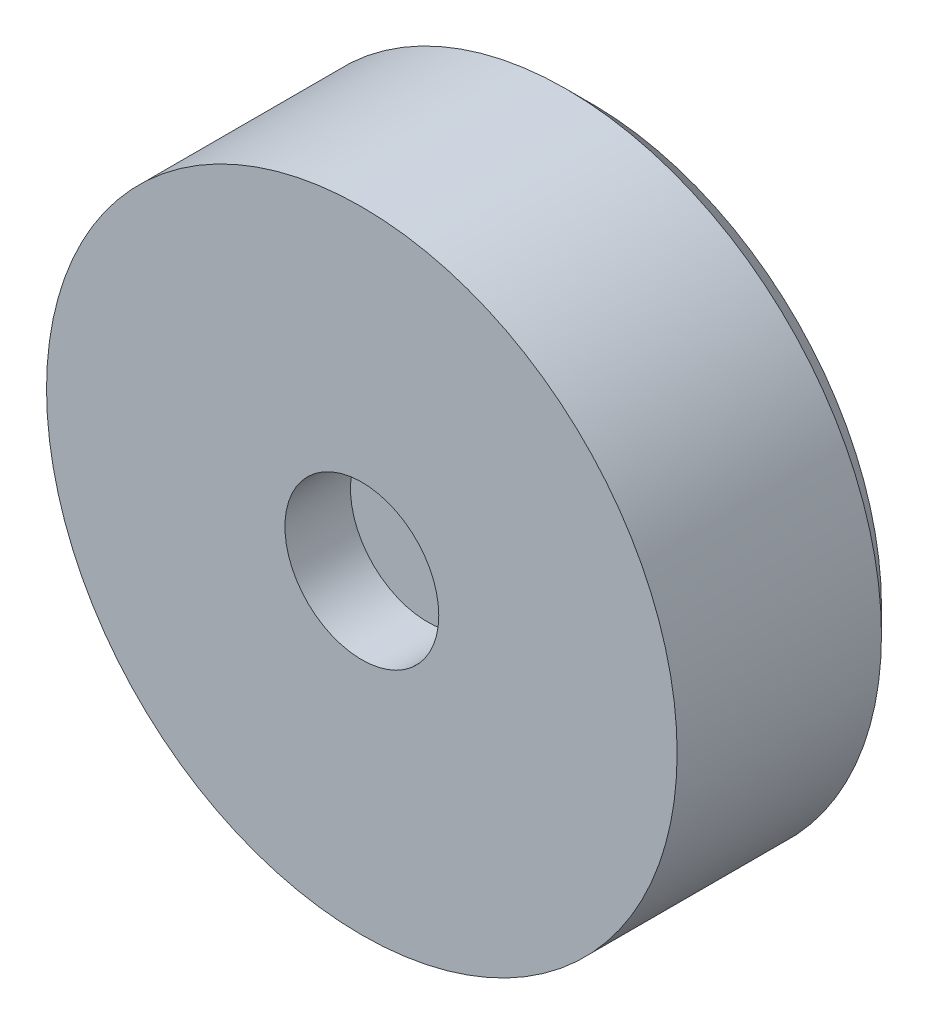
ISO-10303-21;
HEADER;
FILE_DESCRIPTION(('STEP AP214'),'2;1');
FILE_NAME('part.step','',(''),(''),'','','');
FILE_SCHEMA(('AUTOMOTIVE_DESIGN { 1 0 10303 214 1 1 1 1 }'));
ENDSEC;
DATA;
#1=APPLICATION_CONTEXT('core data for automotive mechanical design processes');
#2=APPLICATION_PROTOCOL_DEFINITION('international standard','automotive_design',2000,#1);
#3=PRODUCT_CONTEXT('',#1,'mechanical');
#4=PRODUCT('Part','Part','',(#3));
#5=PRODUCT_RELATED_PRODUCT_CATEGORY('part','',(#4));
#6=PRODUCT_DEFINITION_FORMATION('','',#4);
#7=PRODUCT_DEFINITION_CONTEXT('part definition',#1,'design');
#8=PRODUCT_DEFINITION('design','',#6,#7);
#9=PRODUCT_DEFINITION_SHAPE('','',#8);
#10=(LENGTH_UNIT() NAMED_UNIT(*) SI_UNIT(.MILLI.,.METRE.));
#11=(NAMED_UNIT(*) PLANE_ANGLE_UNIT() SI_UNIT($,.RADIAN.));
#12=(NAMED_UNIT(*) SI_UNIT($,.STERADIAN.) SOLID_ANGLE_UNIT());
#13=UNCERTAINTY_MEASURE_WITH_UNIT(LENGTH_MEASURE(1.E-05),#10,'distance_accuracy_value','');
#14=(GEOMETRIC_REPRESENTATION_CONTEXT(3) GLOBAL_UNCERTAINTY_ASSIGNED_CONTEXT((#13)) GLOBAL_UNIT_ASSIGNED_CONTEXT((#10,
#11,#12)) REPRESENTATION_CONTEXT('',''));
#15=CARTESIAN_POINT('',(0.,0.,0.));
#16=DIRECTION('',(0.,0.,1.));
#17=DIRECTION('',(1.,0.,0.));
#18=AXIS2_PLACEMENT_3D('',#15,#16,#17);
#19=CARTESIAN_POINT('',(0.,0.,0.));
#20=DIRECTION('',(0.,0.,1.));
#21=DIRECTION('',(1.,0.,0.));
#22=AXIS2_PLACEMENT_3D('',#19,#20,#21);
#23=PLANE('',#22);
#24=CARTESIAN_POINT('',(0.,0.,0.));
#25=DIRECTION('',(0.,0.,1.));
#26=DIRECTION('',(1.,0.,0.));
#27=AXIS2_PLACEMENT_3D('',#24,#25,#26);
#28=CIRCLE('',#27,11.5);
#29=CARTESIAN_POINT('',(11.5,0.,0.));
#30=VERTEX_POINT('',#29);
#31=EDGE_CURVE('E41',#30,#30,#28,.F.);
#32=ORIENTED_EDGE('',*,*,#31,.T.);
#33=EDGE_LOOP('',(#32));
#34=FACE_BOUND('',#33,.T.);
#35=DIRECTION('',(0.5,-0.866025403784439,0.));
#36=VECTOR('',#35,1.);
#37=CARTESIAN_POINT('',(-9.8726896031426,0.,0.));
#38=LINE('',#37,#36);
#39=CARTESIAN_POINT('',(-9.8726896031426,0.,0.));
#40=VERTEX_POINT('',#39);
#41=CARTESIAN_POINT('',(-4.9363448015713,-8.55,0.));
#42=VERTEX_POINT('',#41);
#43=EDGE_CURVE('E48',#40,#42,#38,.T.);
#44=ORIENTED_EDGE('',*,*,#43,.T.);
#45=DIRECTION('',(1.,0.,0.));
#46=VECTOR('',#45,1.);
#47=CARTESIAN_POINT('',(-4.9363448015713,-8.55,0.));
#48=LINE('',#47,#46);
#49=CARTESIAN_POINT('',(4.9363448015713,-8.55,0.));
#50=VERTEX_POINT('',#49);
#51=EDGE_CURVE('E107',#42,#50,#48,.T.);
#52=ORIENTED_EDGE('',*,*,#51,.T.);
#53=DIRECTION('',(0.5,0.866025403784439,0.));
#54=VECTOR('',#53,1.);
#55=CARTESIAN_POINT('',(4.9363448015713,-8.55,0.));
#56=LINE('',#55,#54);
#57=CARTESIAN_POINT('',(9.8726896031426,0.,0.));
#58=VERTEX_POINT('',#57);
#59=EDGE_CURVE('E105',#50,#58,#56,.T.);
#60=ORIENTED_EDGE('',*,*,#59,.T.);
#61=DIRECTION('',(-0.5,0.866025403784439,0.));
#62=VECTOR('',#61,1.);
#63=CARTESIAN_POINT('',(9.8726896031426,0.,0.));
#64=LINE('',#63,#62);
#65=CARTESIAN_POINT('',(4.9363448015713,8.55,0.));
#66=VERTEX_POINT('',#65);
#67=EDGE_CURVE('E84',#58,#66,#64,.T.);
#68=ORIENTED_EDGE('',*,*,#67,.T.);
#69=DIRECTION('',(-1.,0.,0.));
#70=VECTOR('',#69,1.);
#71=CARTESIAN_POINT('',(4.9363448015713,8.55,0.));
#72=LINE('',#71,#70);
#73=CARTESIAN_POINT('',(-4.9363448015713,8.55,0.));
#74=VERTEX_POINT('',#73);
#75=EDGE_CURVE('E95',#66,#74,#72,.T.);
#76=ORIENTED_EDGE('',*,*,#75,.T.);
#77=DIRECTION('',(-0.5,-0.866025403784439,0.));
#78=VECTOR('',#77,1.);
#79=CARTESIAN_POINT('',(-4.9363448015713,8.55,0.));
#80=LINE('',#79,#78);
#81=EDGE_CURVE('E101',#74,#40,#80,.T.);
#82=ORIENTED_EDGE('',*,*,#81,.T.);
#83=EDGE_LOOP('',(#44,#52,#60,#68,#76,#82));
#84=FACE_BOUND('',#83,.T.);
#85=ADVANCED_FACE('F33',(#34,#84),#23,.F.);
#86=CARTESIAN_POINT('',(0.,0.,2.5));
#87=DIRECTION('',(0.,0.,-1.));
#88=DIRECTION('',(-1.,0.,0.));
#89=AXIS2_PLACEMENT_3D('',#86,#87,#88);
#90=CYLINDRICAL_SURFACE('',#89,12.5);
#91=CARTESIAN_POINT('',(0.,0.,1.));
#92=DIRECTION('',(0.,0.,1.));
#93=DIRECTION('',(1.,0.,0.));
#94=AXIS2_PLACEMENT_3D('',#91,#92,#93);
#95=CIRCLE('',#94,12.5);
#96=CARTESIAN_POINT('',(12.5,0.,1.));
#97=VERTEX_POINT('',#96);
#98=EDGE_CURVE('E124',#97,#97,#95,.T.);
#99=ORIENTED_EDGE('',*,*,#98,.T.);
#100=EDGE_LOOP('',(#99));
#101=FACE_BOUND('',#100,.T.);
#102=CARTESIAN_POINT('',(0.,0.,9.1));
#103=DIRECTION('',(0.,0.,1.));
#104=DIRECTION('',(1.,0.,0.));
#105=AXIS2_PLACEMENT_3D('',#102,#103,#104);
#106=CIRCLE('',#105,12.5);
#107=CARTESIAN_POINT('',(12.5,0.,9.1));
#108=VERTEX_POINT('',#107);
#109=EDGE_CURVE('E142',#108,#108,#106,.T.);
#110=ORIENTED_EDGE('',*,*,#109,.F.);
#111=EDGE_LOOP('',(#110));
#112=FACE_BOUND('',#111,.T.);
#113=ADVANCED_FACE('F136',(#101,#112),#90,.T.);
#114=CARTESIAN_POINT('',(-9.8726896031426,0.,2.5));
#115=DIRECTION('',(0.866025403784438,0.5,0.));
#116=DIRECTION('',(-0.5,0.866025403784438,0.));
#117=AXIS2_PLACEMENT_3D('',#114,#115,#116);
#118=PLANE('',#117);
#119=ORIENTED_EDGE('',*,*,#43,.F.);
#120=DIRECTION('',(0.,0.,-1.));
#121=VECTOR('',#120,1.);
#122=CARTESIAN_POINT('',(-9.8726896031426,0.,2.5));
#123=LINE('',#122,#121);
#124=CARTESIAN_POINT('',(-9.8726896031426,0.,2.5));
#125=VERTEX_POINT('',#124);
#126=EDGE_CURVE('E112',#125,#40,#123,.T.);
#127=ORIENTED_EDGE('',*,*,#126,.F.);
#128=DIRECTION('',(0.5,-0.866025403784439,0.));
#129=VECTOR('',#128,1.);
#130=CARTESIAN_POINT('',(-9.8726896031426,0.,2.5));
#131=LINE('',#130,#129);
#132=CARTESIAN_POINT('',(-4.9363448015713,-8.55,2.5));
#133=VERTEX_POINT('',#132);
#134=EDGE_CURVE('E57',#125,#133,#131,.T.);
#135=ORIENTED_EDGE('',*,*,#134,.T.);
#136=DIRECTION('',(0.,0.,-1.));
#137=VECTOR('',#136,1.);
#138=CARTESIAN_POINT('',(-4.9363448015713,-8.55,2.5));
#139=LINE('',#138,#137);
#140=EDGE_CURVE('E119',#133,#42,#139,.T.);
#141=ORIENTED_EDGE('',*,*,#140,.T.);
#142=EDGE_LOOP('',(#119,#127,#135,#141));
#143=FACE_BOUND('',#142,.T.);
#144=ADVANCED_FACE('F139',(#143),#118,.T.);
#145=CARTESIAN_POINT('',(-4.9363448015713,-8.55,2.5));
#146=DIRECTION('',(0.,1.,0.));
#147=DIRECTION('',(-1.,0.,0.));
#148=AXIS2_PLACEMENT_3D('',#145,#146,#147);
#149=PLANE('',#148);
#150=ORIENTED_EDGE('',*,*,#51,.F.);
#151=ORIENTED_EDGE('',*,*,#140,.F.);
#152=DIRECTION('',(1.,0.,0.));
#153=VECTOR('',#152,1.);
#154=CARTESIAN_POINT('',(-4.9363448015713,-8.55,2.5));
#155=LINE('',#154,#153);
#156=CARTESIAN_POINT('',(4.9363448015713,-8.55,2.5));
#157=VERTEX_POINT('',#156);
#158=EDGE_CURVE('E153',#133,#157,#155,.T.);
#159=ORIENTED_EDGE('',*,*,#158,.T.);
#160=DIRECTION('',(0.,0.,-1.));
#161=VECTOR('',#160,1.);
#162=CARTESIAN_POINT('',(4.9363448015713,-8.55,2.5));
#163=LINE('',#162,#161);
#164=EDGE_CURVE('E117',#157,#50,#163,.T.);
#165=ORIENTED_EDGE('',*,*,#164,.T.);
#166=EDGE_LOOP('',(#150,#151,#159,#165));
#167=FACE_BOUND('',#166,.T.);
#168=ADVANCED_FACE('F165',(#167),#149,.T.);
#169=CARTESIAN_POINT('',(4.9363448015713,-8.55,2.5));
#170=DIRECTION('',(-0.866025403784439,0.5,0.));
#171=DIRECTION('',(-0.5,-0.866025403784439,0.));
#172=AXIS2_PLACEMENT_3D('',#169,#170,#171);
#173=PLANE('',#172);
#174=ORIENTED_EDGE('',*,*,#59,.F.);
#175=ORIENTED_EDGE('',*,*,#164,.F.);
#176=DIRECTION('',(0.5,0.866025403784439,0.));
#177=VECTOR('',#176,1.);
#178=CARTESIAN_POINT('',(4.9363448015713,-8.55,2.5));
#179=LINE('',#178,#177);
#180=CARTESIAN_POINT('',(9.8726896031426,0.,2.5));
#181=VERTEX_POINT('',#180);
#182=EDGE_CURVE('E156',#157,#181,#179,.T.);
#183=ORIENTED_EDGE('',*,*,#182,.T.);
#184=DIRECTION('',(0.,0.,-1.));
#185=VECTOR('',#184,1.);
#186=CARTESIAN_POINT('',(9.8726896031426,0.,2.5));
#187=LINE('',#186,#185);
#188=EDGE_CURVE('E91',#181,#58,#187,.T.);
#189=ORIENTED_EDGE('',*,*,#188,.T.);
#190=EDGE_LOOP('',(#174,#175,#183,#189));
#191=FACE_BOUND('',#190,.T.);
#192=ADVANCED_FACE('F197',(#191),#173,.T.);
#193=CARTESIAN_POINT('',(9.8726896031426,0.,2.5));
#194=DIRECTION('',(-0.866025403784439,-0.5,0.));
#195=DIRECTION('',(0.5,-0.866025403784439,0.));
#196=AXIS2_PLACEMENT_3D('',#193,#194,#195);
#197=PLANE('',#196);
#198=ORIENTED_EDGE('',*,*,#67,.F.);
#199=ORIENTED_EDGE('',*,*,#188,.F.);
#200=DIRECTION('',(-0.5,0.866025403784439,0.));
#201=VECTOR('',#200,1.);
#202=CARTESIAN_POINT('',(9.8726896031426,0.,2.5));
#203=LINE('',#202,#201);
#204=CARTESIAN_POINT('',(4.9363448015713,8.55,2.5));
#205=VERTEX_POINT('',#204);
#206=EDGE_CURVE('E88',#181,#205,#203,.T.);
#207=ORIENTED_EDGE('',*,*,#206,.T.);
#208=DIRECTION('',(0.,0.,-1.));
#209=VECTOR('',#208,1.);
#210=CARTESIAN_POINT('',(4.9363448015713,8.55,2.5));
#211=LINE('',#210,#209);
#212=EDGE_CURVE('E79',#205,#66,#211,.T.);
#213=ORIENTED_EDGE('',*,*,#212,.T.);
#214=EDGE_LOOP('',(#198,#199,#207,#213));
#215=FACE_BOUND('',#214,.T.);
#216=ADVANCED_FACE('F81',(#215),#197,.T.);
#217=CARTESIAN_POINT('',(4.9363448015713,8.55,2.5));
#218=DIRECTION('',(0.,-1.,0.));
#219=DIRECTION('',(1.,0.,0.));
#220=AXIS2_PLACEMENT_3D('',#217,#218,#219);
#221=PLANE('',#220);
#222=ORIENTED_EDGE('',*,*,#75,.F.);
#223=ORIENTED_EDGE('',*,*,#212,.F.);
#224=DIRECTION('',(-1.,0.,0.));
#225=VECTOR('',#224,1.);
#226=CARTESIAN_POINT('',(4.9363448015713,8.55,2.5));
#227=LINE('',#226,#225);
#228=CARTESIAN_POINT('',(-4.9363448015713,8.55,2.5));
#229=VERTEX_POINT('',#228);
#230=EDGE_CURVE('E160',#205,#229,#227,.T.);
#231=ORIENTED_EDGE('',*,*,#230,.T.);
#232=DIRECTION('',(0.,0.,-1.));
#233=VECTOR('',#232,1.);
#234=CARTESIAN_POINT('',(-4.9363448015713,8.55,2.5));
#235=LINE('',#234,#233);
#236=EDGE_CURVE('E92',#229,#74,#235,.T.);
#237=ORIENTED_EDGE('',*,*,#236,.T.);
#238=EDGE_LOOP('',(#222,#223,#231,#237));
#239=FACE_BOUND('',#238,.T.);
#240=ADVANCED_FACE('F96',(#239),#221,.T.);
#241=CARTESIAN_POINT('',(-4.9363448015713,8.55,2.5));
#242=DIRECTION('',(0.866025403784439,-0.5,0.));
#243=DIRECTION('',(0.5,0.866025403784439,0.));
#244=AXIS2_PLACEMENT_3D('',#241,#242,#243);
#245=PLANE('',#244);
#246=ORIENTED_EDGE('',*,*,#81,.F.);
#247=ORIENTED_EDGE('',*,*,#236,.F.);
#248=DIRECTION('',(-0.5,-0.866025403784439,0.));
#249=VECTOR('',#248,1.);
#250=CARTESIAN_POINT('',(-4.9363448015713,8.55,2.5));
#251=LINE('',#250,#249);
#252=EDGE_CURVE('E114',#229,#125,#251,.T.);
#253=ORIENTED_EDGE('',*,*,#252,.T.);
#254=ORIENTED_EDGE('',*,*,#126,.T.);
#255=EDGE_LOOP('',(#246,#247,#253,#254));
#256=FACE_BOUND('',#255,.T.);
#257=ADVANCED_FACE('F177',(#256),#245,.T.);
#258=CARTESIAN_POINT('',(0.,0.,2.5));
#259=DIRECTION('',(0.,0.,1.));
#260=DIRECTION('',(1.,0.,0.));
#261=AXIS2_PLACEMENT_3D('',#258,#259,#260);
#262=PLANE('',#261);
#263=CARTESIAN_POINT('',(0.,0.,2.5));
#264=DIRECTION('',(0.,0.,1.));
#265=DIRECTION('',(1.,0.,0.));
#266=AXIS2_PLACEMENT_3D('',#263,#264,#265);
#267=CIRCLE('',#266,1.);
#268=CARTESIAN_POINT('',(1.,0.,2.5));
#269=VERTEX_POINT('',#268);
#270=EDGE_CURVE('E121',#269,#269,#267,.F.);
#271=ORIENTED_EDGE('',*,*,#270,.F.);
#272=EDGE_LOOP('',(#271));
#273=FACE_BOUND('',#272,.T.);
#274=ORIENTED_EDGE('',*,*,#134,.F.);
#275=ORIENTED_EDGE('',*,*,#252,.F.);
#276=ORIENTED_EDGE('',*,*,#230,.F.);
#277=ORIENTED_EDGE('',*,*,#206,.F.);
#278=ORIENTED_EDGE('',*,*,#182,.F.);
#279=ORIENTED_EDGE('',*,*,#158,.F.);
#280=EDGE_LOOP('',(#274,#275,#276,#277,#278,#279));
#281=FACE_BOUND('',#280,.T.);
#282=ADVANCED_FACE('F175',(#273,#281),#262,.F.);
#283=CARTESIAN_POINT('',(0.,0.,0.5));
#284=DIRECTION('',(0.,0.,1.));
#285=DIRECTION('',(1.,0.,0.));
#286=AXIS2_PLACEMENT_3D('',#283,#284,#285);
#287=CYLINDRICAL_SURFACE('',#286,1.);
#288=CARTESIAN_POINT('',(0.,0.,0.5));
#289=DIRECTION('',(0.,0.,-1.));
#290=DIRECTION('',(-1.,0.,0.));
#291=AXIS2_PLACEMENT_3D('',#288,#289,#290);
#292=CIRCLE('',#291,1.);
#293=CARTESIAN_POINT('',(-1.,0.,0.5));
#294=VERTEX_POINT('',#293);
#295=EDGE_CURVE('E144',#294,#294,#292,.T.);
#296=ORIENTED_EDGE('',*,*,#295,.F.);
#297=EDGE_LOOP('',(#296));
#298=FACE_BOUND('',#297,.T.);
#299=ORIENTED_EDGE('',*,*,#270,.T.);
#300=EDGE_LOOP('',(#299));
#301=FACE_BOUND('',#300,.T.);
#302=ADVANCED_FACE('F184',(#298,#301),#287,.T.);
#303=CARTESIAN_POINT('',(0.,0.,0.5));
#304=DIRECTION('',(0.,0.,-1.));
#305=DIRECTION('',(-1.,0.,0.));
#306=AXIS2_PLACEMENT_3D('',#303,#304,#305);
#307=PLANE('',#306);
#308=ORIENTED_EDGE('',*,*,#295,.T.);
#309=EDGE_LOOP('',(#308));
#310=FACE_BOUND('',#309,.T.);
#311=ADVANCED_FACE('F133',(#310),#307,.T.);
#312=CARTESIAN_POINT('',(0.,0.,1.));
#313=DIRECTION('',(0.,0.,1.));
#314=DIRECTION('',(1.,0.,0.));
#315=AXIS2_PLACEMENT_3D('',#312,#313,#314);
#316=CONICAL_SURFACE('',#315,12.5,0.785398163397451);
#317=ORIENTED_EDGE('',*,*,#31,.F.);
#318=EDGE_LOOP('',(#317));
#319=FACE_BOUND('',#318,.T.);
#320=ORIENTED_EDGE('',*,*,#98,.F.);
#321=EDGE_LOOP('',(#320));
#322=FACE_BOUND('',#321,.T.);
#323=ADVANCED_FACE('F35',(#319,#322),#316,.T.);
#324=CARTESIAN_POINT('',(0.,0.,9.1));
#325=DIRECTION('',(0.,0.,1.));
#326=DIRECTION('',(1.,0.,0.));
#327=AXIS2_PLACEMENT_3D('',#324,#325,#326);
#328=PLANE('',#327);
#329=ORIENTED_EDGE('',*,*,#109,.T.);
#330=EDGE_LOOP('',(#329));
#331=FACE_BOUND('',#330,.T.);
#332=CARTESIAN_POINT('',(0.,0.,9.1));
#333=DIRECTION('',(0.,0.,1.));
#334=DIRECTION('',(1.,0.,0.));
#335=AXIS2_PLACEMENT_3D('',#332,#333,#334);
#336=CIRCLE('',#335,3.05);
#337=CARTESIAN_POINT('',(3.05,0.,9.1));
#338=VERTEX_POINT('',#337);
#339=EDGE_CURVE('E145',#338,#338,#336,.T.);
#340=ORIENTED_EDGE('',*,*,#339,.F.);
#341=EDGE_LOOP('',(#340));
#342=FACE_BOUND('',#341,.T.);
#343=ADVANCED_FACE('F132',(#331,#342),#328,.T.);
#344=CARTESIAN_POINT('',(0.,0.,9.1));
#345=DIRECTION('',(0.,0.,-1.));
#346=DIRECTION('',(-1.,0.,0.));
#347=AXIS2_PLACEMENT_3D('',#344,#345,#346);
#348=CYLINDRICAL_SURFACE('',#347,3.05);
#349=ORIENTED_EDGE('',*,*,#339,.T.);
#350=EDGE_LOOP('',(#349));
#351=FACE_BOUND('',#350,.T.);
#352=CARTESIAN_POINT('',(0.,0.,6.5));
#353=DIRECTION('',(0.,0.,1.));
#354=DIRECTION('',(1.,0.,0.));
#355=AXIS2_PLACEMENT_3D('',#352,#353,#354);
#356=CIRCLE('',#355,3.05);
#357=CARTESIAN_POINT('',(3.05,0.,6.5));
#358=VERTEX_POINT('',#357);
#359=EDGE_CURVE('E11',#358,#358,#356,.F.);
#360=ORIENTED_EDGE('',*,*,#359,.T.);
#361=EDGE_LOOP('',(#360));
#362=FACE_BOUND('',#361,.T.);
#363=ADVANCED_FACE('F266',(#351,#362),#348,.F.);
#364=CARTESIAN_POINT('',(0.,0.,6.5));
#365=DIRECTION('',(0.,0.,1.));
#366=DIRECTION('',(1.,0.,0.));
#367=AXIS2_PLACEMENT_3D('',#364,#365,#366);
#368=PLANE('',#367);
#369=ORIENTED_EDGE('',*,*,#359,.F.);
#370=EDGE_LOOP('',(#369));
#371=FACE_BOUND('',#370,.T.);
#372=ADVANCED_FACE('F275',(#371),#368,.T.);
#373=CLOSED_SHELL('',(#85,#113,#144,#168,#192,#216,#240,#257,#282,#302,#311,#323,#343,#363,#372));
#374=MANIFOLD_SOLID_BREP('B2',#373);
#375=ADVANCED_BREP_SHAPE_REPRESENTATION('',(#18,#374),#14);
#376=SHAPE_DEFINITION_REPRESENTATION(#9,#375);
ENDSEC;
END-ISO-10303-21;
